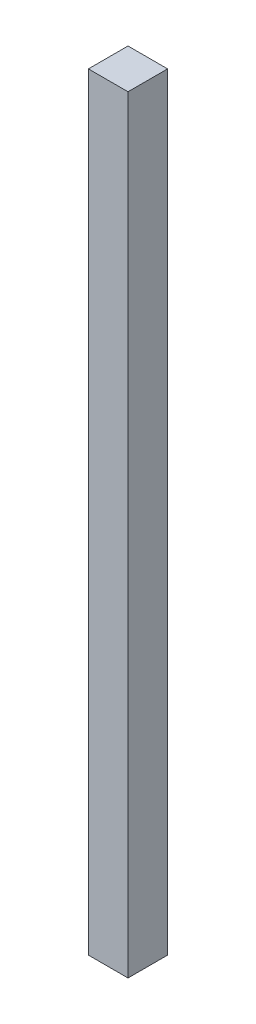
ISO-10303-21;
HEADER;
FILE_DESCRIPTION(('STEP AP214'),'2;1');
FILE_NAME('part.step','',(''),(''),'','','');
FILE_SCHEMA(('AUTOMOTIVE_DESIGN { 1 0 10303 214 1 1 1 1 }'));
ENDSEC;
DATA;
#1=APPLICATION_CONTEXT('core data for automotive mechanical design processes');
#2=APPLICATION_PROTOCOL_DEFINITION('international standard','automotive_design',2000,#1);
#3=PRODUCT_CONTEXT('',#1,'mechanical');
#4=PRODUCT('Part','Part','',(#3));
#5=PRODUCT_RELATED_PRODUCT_CATEGORY('part','',(#4));
#6=PRODUCT_DEFINITION_FORMATION('','',#4);
#7=PRODUCT_DEFINITION_CONTEXT('part definition',#1,'design');
#8=PRODUCT_DEFINITION('design','',#6,#7);
#9=PRODUCT_DEFINITION_SHAPE('','',#8);
#10=(LENGTH_UNIT() NAMED_UNIT(*) SI_UNIT(.MILLI.,.METRE.));
#11=(NAMED_UNIT(*) PLANE_ANGLE_UNIT() SI_UNIT($,.RADIAN.));
#12=(NAMED_UNIT(*) SI_UNIT($,.STERADIAN.) SOLID_ANGLE_UNIT());
#13=UNCERTAINTY_MEASURE_WITH_UNIT(LENGTH_MEASURE(1.E-05),#10,'distance_accuracy_value','');
#14=(GEOMETRIC_REPRESENTATION_CONTEXT(3) GLOBAL_UNCERTAINTY_ASSIGNED_CONTEXT((#13)) GLOBAL_UNIT_ASSIGNED_CONTEXT((#10,
#11,#12)) REPRESENTATION_CONTEXT('',''));
#15=CARTESIAN_POINT('',(0.,0.,0.));
#16=DIRECTION('',(0.,0.,1.));
#17=DIRECTION('',(1.,0.,0.));
#18=AXIS2_PLACEMENT_3D('',#15,#16,#17);
#19=CARTESIAN_POINT('',(-0.32,0.,-0.32));
#20=DIRECTION('',(-1.,0.,0.));
#21=DIRECTION('',(0.,0.,1.));
#22=AXIS2_PLACEMENT_3D('',#19,#20,#21);
#23=PLANE('',#22);
#24=DIRECTION('',(0.,1.,0.));
#25=VECTOR('',#24,1.);
#26=CARTESIAN_POINT('',(-0.32,0.,-0.32));
#27=LINE('',#26,#25);
#28=CARTESIAN_POINT('',(-0.32,-4.2,-0.32));
#29=VERTEX_POINT('',#28);
#30=CARTESIAN_POINT('',(-0.32,8.2,-0.32));
#31=VERTEX_POINT('',#30);
#32=EDGE_CURVE('E62',#29,#31,#27,.T.);
#33=ORIENTED_EDGE('',*,*,#32,.F.);
#34=DIRECTION('',(0.,0.,1.));
#35=VECTOR('',#34,1.);
#36=CARTESIAN_POINT('',(-0.32,-4.2,-0.32));
#37=LINE('',#36,#35);
#38=CARTESIAN_POINT('',(-0.32,-4.2,0.32));
#39=VERTEX_POINT('',#38);
#40=EDGE_CURVE('E20',#29,#39,#37,.T.);
#41=ORIENTED_EDGE('',*,*,#40,.T.);
#42=DIRECTION('',(0.,1.,0.));
#43=VECTOR('',#42,1.);
#44=CARTESIAN_POINT('',(-0.32,0.,0.32));
#45=LINE('',#44,#43);
#46=CARTESIAN_POINT('',(-0.32,8.2,0.32));
#47=VERTEX_POINT('',#46);
#48=EDGE_CURVE('E69',#47,#39,#45,.F.);
#49=ORIENTED_EDGE('',*,*,#48,.F.);
#50=DIRECTION('',(0.,0.,1.));
#51=VECTOR('',#50,1.);
#52=CARTESIAN_POINT('',(-0.32,8.2,0.));
#53=LINE('',#52,#51);
#54=EDGE_CURVE('E56',#31,#47,#53,.T.);
#55=ORIENTED_EDGE('',*,*,#54,.F.);
#56=EDGE_LOOP('',(#33,#41,#49,#55));
#57=FACE_BOUND('',#56,.T.);
#58=ADVANCED_FACE('F17',(#57),#23,.T.);
#59=CARTESIAN_POINT('',(0.32,0.,-0.32));
#60=DIRECTION('',(0.,0.,-1.));
#61=DIRECTION('',(-1.,0.,0.));
#62=AXIS2_PLACEMENT_3D('',#59,#60,#61);
#63=PLANE('',#62);
#64=DIRECTION('',(0.,1.,0.));
#65=VECTOR('',#64,1.);
#66=CARTESIAN_POINT('',(0.32,0.,-0.32));
#67=LINE('',#66,#65);
#68=CARTESIAN_POINT('',(0.32,-4.2,-0.32));
#69=VERTEX_POINT('',#68);
#70=CARTESIAN_POINT('',(0.32,8.2,-0.32));
#71=VERTEX_POINT('',#70);
#72=EDGE_CURVE('E83',#69,#71,#67,.T.);
#73=ORIENTED_EDGE('',*,*,#72,.F.);
#74=DIRECTION('',(1.,0.,0.));
#75=VECTOR('',#74,1.);
#76=CARTESIAN_POINT('',(0.,-4.2,-0.32));
#77=LINE('',#76,#75);
#78=EDGE_CURVE('E67',#29,#69,#77,.T.);
#79=ORIENTED_EDGE('',*,*,#78,.F.);
#80=ORIENTED_EDGE('',*,*,#32,.T.);
#81=DIRECTION('',(1.,0.,0.));
#82=VECTOR('',#81,1.);
#83=CARTESIAN_POINT('',(0.,8.2,-0.32));
#84=LINE('',#83,#82);
#85=EDGE_CURVE('E64',#71,#31,#84,.F.);
#86=ORIENTED_EDGE('',*,*,#85,.F.);
#87=EDGE_LOOP('',(#73,#79,#80,#86));
#88=FACE_BOUND('',#87,.T.);
#89=ADVANCED_FACE('F63',(#88),#63,.T.);
#90=CARTESIAN_POINT('',(0.,8.2,0.));
#91=DIRECTION('',(0.,1.,0.));
#92=DIRECTION('',(0.,0.,1.));
#93=AXIS2_PLACEMENT_3D('',#90,#91,#92);
#94=PLANE('',#93);
#95=DIRECTION('',(1.,0.,0.));
#96=VECTOR('',#95,1.);
#97=CARTESIAN_POINT('',(-0.32,8.2,0.32));
#98=LINE('',#97,#96);
#99=CARTESIAN_POINT('',(0.32,8.2,0.32));
#100=VERTEX_POINT('',#99);
#101=EDGE_CURVE('E71',#100,#47,#98,.F.);
#102=ORIENTED_EDGE('',*,*,#101,.F.);
#103=DIRECTION('',(0.,0.,-1.));
#104=VECTOR('',#103,1.);
#105=CARTESIAN_POINT('',(0.32,8.2,0.32));
#106=LINE('',#105,#104);
#107=EDGE_CURVE('E75',#71,#100,#106,.F.);
#108=ORIENTED_EDGE('',*,*,#107,.F.);
#109=ORIENTED_EDGE('',*,*,#85,.T.);
#110=ORIENTED_EDGE('',*,*,#54,.T.);
#111=EDGE_LOOP('',(#102,#108,#109,#110));
#112=FACE_BOUND('',#111,.T.);
#113=ADVANCED_FACE('F73',(#112),#94,.T.);
#114=CARTESIAN_POINT('',(-0.32,0.,0.32));
#115=DIRECTION('',(0.,0.,1.));
#116=DIRECTION('',(1.,0.,0.));
#117=AXIS2_PLACEMENT_3D('',#114,#115,#116);
#118=PLANE('',#117);
#119=ORIENTED_EDGE('',*,*,#48,.T.);
#120=DIRECTION('',(1.,0.,0.));
#121=VECTOR('',#120,1.);
#122=CARTESIAN_POINT('',(0.,-4.2,0.32));
#123=LINE('',#122,#121);
#124=CARTESIAN_POINT('',(0.32,-4.2,0.32));
#125=VERTEX_POINT('',#124);
#126=EDGE_CURVE('E35',#125,#39,#123,.F.);
#127=ORIENTED_EDGE('',*,*,#126,.F.);
#128=DIRECTION('',(0.,1.,0.));
#129=VECTOR('',#128,1.);
#130=CARTESIAN_POINT('',(0.32,0.,0.32));
#131=LINE('',#130,#129);
#132=EDGE_CURVE('E26',#100,#125,#131,.F.);
#133=ORIENTED_EDGE('',*,*,#132,.F.);
#134=ORIENTED_EDGE('',*,*,#101,.T.);
#135=EDGE_LOOP('',(#119,#127,#133,#134));
#136=FACE_BOUND('',#135,.T.);
#137=ADVANCED_FACE('F89',(#136),#118,.T.);
#138=CARTESIAN_POINT('',(0.,-4.2,0.));
#139=DIRECTION('',(0.,-1.,0.));
#140=DIRECTION('',(0.,0.,-1.));
#141=AXIS2_PLACEMENT_3D('',#138,#139,#140);
#142=PLANE('',#141);
#143=ORIENTED_EDGE('',*,*,#126,.T.);
#144=ORIENTED_EDGE('',*,*,#40,.F.);
#145=ORIENTED_EDGE('',*,*,#78,.T.);
#146=DIRECTION('',(0.,0.,-1.));
#147=VECTOR('',#146,1.);
#148=CARTESIAN_POINT('',(0.32,-4.2,0.32));
#149=LINE('',#148,#147);
#150=EDGE_CURVE('E11',#125,#69,#149,.T.);
#151=ORIENTED_EDGE('',*,*,#150,.F.);
#152=EDGE_LOOP('',(#143,#144,#145,#151));
#153=FACE_BOUND('',#152,.T.);
#154=ADVANCED_FACE('F91',(#153),#142,.T.);
#155=CARTESIAN_POINT('',(0.32,0.,0.32));
#156=DIRECTION('',(1.,0.,0.));
#157=DIRECTION('',(0.,0.,-1.));
#158=AXIS2_PLACEMENT_3D('',#155,#156,#157);
#159=PLANE('',#158);
#160=ORIENTED_EDGE('',*,*,#132,.T.);
#161=ORIENTED_EDGE('',*,*,#150,.T.);
#162=ORIENTED_EDGE('',*,*,#72,.T.);
#163=ORIENTED_EDGE('',*,*,#107,.T.);
#164=EDGE_LOOP('',(#160,#161,#162,#163));
#165=FACE_BOUND('',#164,.T.);
#166=ADVANCED_FACE('F88',(#165),#159,.T.);
#167=CLOSED_SHELL('',(#58,#89,#113,#137,#154,#166));
#168=MANIFOLD_SOLID_BREP('B1',#167);
#169=ADVANCED_BREP_SHAPE_REPRESENTATION('',(#18,#168),#14);
#170=SHAPE_DEFINITION_REPRESENTATION(#9,#169);
ENDSEC;
END-ISO-10303-21;
